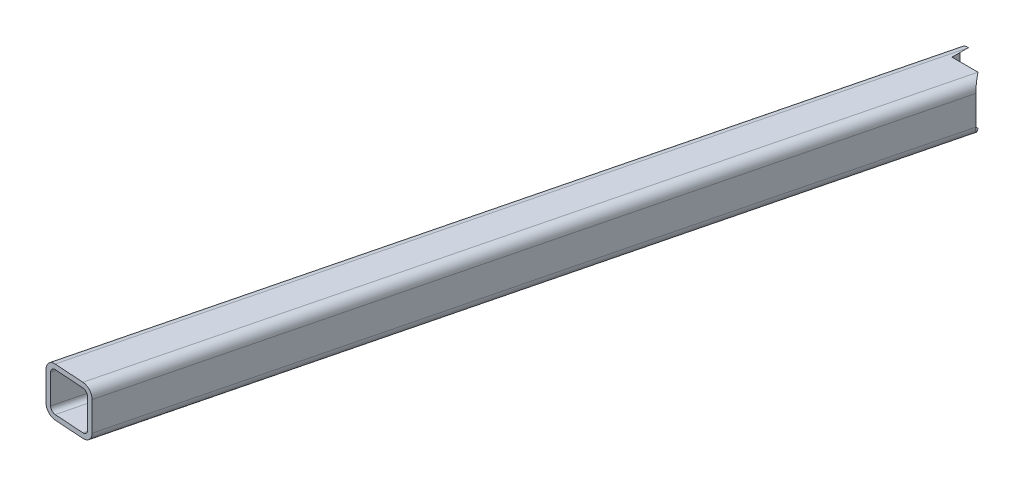
ISO-10303-21;
HEADER;
FILE_DESCRIPTION(('STEP AP214'),'2;1');
FILE_NAME('part.step','',(''),(''),'','','');
FILE_SCHEMA(('AUTOMOTIVE_DESIGN { 1 0 10303 214 1 1 1 1 }'));
ENDSEC;
DATA;
#1=APPLICATION_CONTEXT('core data for automotive mechanical design processes');
#2=APPLICATION_PROTOCOL_DEFINITION('international standard','automotive_design',2000,#1);
#3=PRODUCT_CONTEXT('',#1,'mechanical');
#4=PRODUCT('Part','Part','',(#3));
#5=PRODUCT_RELATED_PRODUCT_CATEGORY('part','',(#4));
#6=PRODUCT_DEFINITION_FORMATION('','',#4);
#7=PRODUCT_DEFINITION_CONTEXT('part definition',#1,'design');
#8=PRODUCT_DEFINITION('design','',#6,#7);
#9=PRODUCT_DEFINITION_SHAPE('','',#8);
#10=(LENGTH_UNIT() NAMED_UNIT(*) SI_UNIT(.MILLI.,.METRE.));
#11=(NAMED_UNIT(*) PLANE_ANGLE_UNIT() SI_UNIT($,.RADIAN.));
#12=(NAMED_UNIT(*) SI_UNIT($,.STERADIAN.) SOLID_ANGLE_UNIT());
#13=UNCERTAINTY_MEASURE_WITH_UNIT(LENGTH_MEASURE(1.E-05),#10,'distance_accuracy_value','');
#14=(GEOMETRIC_REPRESENTATION_CONTEXT(3) GLOBAL_UNCERTAINTY_ASSIGNED_CONTEXT((#13)) GLOBAL_UNIT_ASSIGNED_CONTEXT((#10,
#11,#12)) REPRESENTATION_CONTEXT('',''));
#15=CARTESIAN_POINT('',(0.,0.,0.));
#16=DIRECTION('',(0.,0.,1.));
#17=DIRECTION('',(1.,0.,0.));
#18=AXIS2_PLACEMENT_3D('',#15,#16,#17);
#19=CARTESIAN_POINT('',(-180.820855000872,6.00000000000001,-2001.45521375022));
#20=DIRECTION('',(-0.242535625036333,0.,0.970142500145332));
#21=DIRECTION('',(0.970142500145332,0.,0.242535625036333));
#22=AXIS2_PLACEMENT_3D('',#19,#20,#21);
#23=CYLINDRICAL_SURFACE('',#22,4.);
#24=CARTESIAN_POINT('',(-180.999999999999,6.00000000000001,-2000.73863375371));
#25=DIRECTION('',(-0.122183263695704,0.,0.992507556682903));
#26=DIRECTION('',(-0.992507556682903,0.,-0.122183263695704));
#27=AXIS2_PLACEMENT_3D('',#24,#25,#26);
#28=ELLIPSE('',#27,4.03019601520069,4.);
#29=CARTESIAN_POINT('',(-184.999999999999,6.00000000000001,-2001.23105625618));
#30=VERTEX_POINT('',#29);
#31=CARTESIAN_POINT('',(-180.999999999999,10.,-2000.73863375371));
#32=VERTEX_POINT('',#31);
#33=EDGE_CURVE('E50',#30,#32,#28,.F.);
#34=ORIENTED_EDGE('',*,*,#33,.F.);
#35=DIRECTION('',(-0.242535625036333,0.,0.970142500145332));
#36=VECTOR('',#35,1.);
#37=CARTESIAN_POINT('',(-184.701425001453,6.00000000000001,-2002.42535625036));
#38=LINE('',#37,#36);
#39=CARTESIAN_POINT('',(-260.141225962763,6.00000000000001,-1700.66615240513));
#40=VERTEX_POINT('',#39);
#41=EDGE_CURVE('E44',#30,#40,#38,.T.);
#42=ORIENTED_EDGE('',*,*,#41,.T.);
#43=CARTESIAN_POINT('',(-256.084735577658,6.,-1700.39969144308));
#44=DIRECTION('',(-0.0655463023942976,0.,0.997849528858152));
#45=DIRECTION('',(-0.997849528858152,0.,-0.0655463023942976));
#46=AXIS2_PLACEMENT_3D('',#43,#44,#45);
#47=ELLIPSE('',#46,4.06523255038944,4.);
#48=CARTESIAN_POINT('',(-256.084735577658,10.,-1700.39969144308));
#49=VERTEX_POINT('',#48);
#50=EDGE_CURVE('E252',#49,#40,#47,.T.);
#51=ORIENTED_EDGE('',*,*,#50,.F.);
#52=DIRECTION('',(-0.242535625036333,0.,0.970142500145332));
#53=VECTOR('',#52,1.);
#54=CARTESIAN_POINT('',(-180.820855000872,10.,-2001.45521375022));
#55=LINE('',#54,#53);
#56=EDGE_CURVE('E198',#32,#49,#55,.T.);
#57=ORIENTED_EDGE('',*,*,#56,.F.);
#58=EDGE_LOOP('',(#34,#42,#51,#57));
#59=FACE_BOUND('',#58,.T.);
#60=ADVANCED_FACE('F41',(#59),#23,.T.);
#61=CARTESIAN_POINT('',(-180.820855000872,10.,-2001.45521375022));
#62=DIRECTION('',(0.,-1.,0.));
#63=DIRECTION('',(0.,0.,-1.));
#64=AXIS2_PLACEMENT_3D('',#61,#62,#63);
#65=PLANE('',#64);
#66=DIRECTION('',(-1.,0.,0.));
#67=VECTOR('',#66,1.);
#68=CARTESIAN_POINT('',(175.,10.,-1994.));
#69=LINE('',#68,#67);
#70=CARTESIAN_POINT('',(-170.315341561574,10.,-1994.));
#71=VERTEX_POINT('',#70);
#72=CARTESIAN_POINT('',(-181.,10.,-1994.));
#73=VERTEX_POINT('',#72);
#74=EDGE_CURVE('E207',#71,#73,#69,.T.);
#75=ORIENTED_EDGE('',*,*,#74,.T.);
#76=DIRECTION('',(0.,0.,-1.));
#77=VECTOR('',#76,1.);
#78=CARTESIAN_POINT('',(-180.999999999999,10.,-2000.));
#79=LINE('',#78,#77);
#80=EDGE_CURVE('E200',#73,#32,#79,.T.);
#81=ORIENTED_EDGE('',*,*,#80,.T.);
#82=ORIENTED_EDGE('',*,*,#56,.T.);
#83=DIRECTION('',(-0.997849528858152,0.,-0.0655463023942976));
#84=VECTOR('',#83,1.);
#85=CARTESIAN_POINT('',(-200.834853438986,10.,-1696.77046140671));
#86=LINE('',#85,#84);
#87=CARTESIAN_POINT('',(-243.915264422343,10.,-1699.60030855692));
#88=VERTEX_POINT('',#87);
#89=EDGE_CURVE('E254',#88,#49,#86,.T.);
#90=ORIENTED_EDGE('',*,*,#89,.F.);
#91=DIRECTION('',(-0.242535625036333,0.,0.970142500145332));
#92=VECTOR('',#91,1.);
#93=CARTESIAN_POINT('',(-169.179144999128,10.,-1998.54478624978));
#94=LINE('',#93,#92);
#95=EDGE_CURVE('E194',#71,#88,#94,.T.);
#96=ORIENTED_EDGE('',*,*,#95,.F.);
#97=EDGE_LOOP('',(#75,#81,#82,#90,#96));
#98=FACE_BOUND('',#97,.T.);
#99=ADVANCED_FACE('F381',(#98),#65,.F.);
#100=CARTESIAN_POINT('',(-169.179144999128,6.00000000000001,-1998.54478624978));
#101=DIRECTION('',(-0.242535625036333,0.,0.970142500145332));
#102=DIRECTION('',(0.970142500145332,0.,0.242535625036333));
#103=AXIS2_PLACEMENT_3D('',#100,#101,#102);
#104=CYLINDRICAL_SURFACE('',#103,4.);
#105=CARTESIAN_POINT('',(-170.315341561574,6.00000000000001,-1994.));
#106=DIRECTION('',(-0.788205438016109,0.,0.615412209402636));
#107=DIRECTION('',(0.615412209402636,0.,0.788205438016109));
#108=AXIS2_PLACEMENT_3D('',#105,#106,#107);
#109=ELLIPSE('',#108,5.07481908532361,4.);
#110=CARTESIAN_POINT('',(-167.192235935956,6.00000000000001,-1990.));
#111=VERTEX_POINT('',#110);
#112=EDGE_CURVE('E280',#71,#111,#109,.F.);
#113=ORIENTED_EDGE('',*,*,#112,.F.);
#114=ORIENTED_EDGE('',*,*,#95,.T.);
#115=CARTESIAN_POINT('',(-243.915264422343,6.00000000000001,-1699.60030855692));
#116=DIRECTION('',(-0.0655463023942976,0.,0.997849528858152));
#117=DIRECTION('',(-0.997849528858152,0.,-0.0655463023942976));
#118=AXIS2_PLACEMENT_3D('',#115,#116,#117);
#119=ELLIPSE('',#118,4.06523255038944,4.);
#120=CARTESIAN_POINT('',(-239.858774037238,6.00000000000001,-1699.33384759487));
#121=VERTEX_POINT('',#120);
#122=EDGE_CURVE('E277',#121,#88,#119,.T.);
#123=ORIENTED_EDGE('',*,*,#122,.F.);
#124=DIRECTION('',(-0.242535625036333,0.,0.970142500145332));
#125=VECTOR('',#124,1.);
#126=CARTESIAN_POINT('',(-165.298574998547,6.00000000000001,-1997.57464374964));
#127=LINE('',#126,#125);
#128=EDGE_CURVE('E191',#111,#121,#127,.T.);
#129=ORIENTED_EDGE('',*,*,#128,.F.);
#130=EDGE_LOOP('',(#113,#114,#123,#129));
#131=FACE_BOUND('',#130,.T.);
#132=ADVANCED_FACE('F386',(#131),#104,.T.);
#133=CARTESIAN_POINT('',(-169.179144999128,-6.,-1998.54478624978));
#134=DIRECTION('',(-0.242535625036333,0.,0.970142500145332));
#135=DIRECTION('',(0.970142500145332,0.,0.242535625036333));
#136=AXIS2_PLACEMENT_3D('',#133,#134,#135);
#137=CYLINDRICAL_SURFACE('',#136,4.);
#138=CARTESIAN_POINT('',(-170.315341561574,-6.00000000000001,-1994.));
#139=DIRECTION('',(-0.788205438016109,0.,0.615412209402636));
#140=DIRECTION('',(0.615412209402636,0.,0.788205438016109));
#141=AXIS2_PLACEMENT_3D('',#138,#139,#140);
#142=ELLIPSE('',#141,5.07481908532361,4.);
#143=CARTESIAN_POINT('',(-167.192235935956,-6.00000000000001,-1990.));
#144=VERTEX_POINT('',#143);
#145=CARTESIAN_POINT('',(-170.315341561574,-10.,-1994.));
#146=VERTEX_POINT('',#145);
#147=EDGE_CURVE('E83',#144,#146,#142,.F.);
#148=ORIENTED_EDGE('',*,*,#147,.F.);
#149=DIRECTION('',(-0.242535625036333,0.,0.970142500145332));
#150=VECTOR('',#149,1.);
#151=CARTESIAN_POINT('',(-165.298574998547,-6.00000000000001,-1997.57464374964));
#152=LINE('',#151,#150);
#153=CARTESIAN_POINT('',(-239.858774037238,-6.00000000000001,-1699.33384759487));
#154=VERTEX_POINT('',#153);
#155=EDGE_CURVE('E186',#144,#154,#152,.T.);
#156=ORIENTED_EDGE('',*,*,#155,.T.);
#157=CARTESIAN_POINT('',(-243.915264422343,-6.00000000000001,-1699.60030855692));
#158=DIRECTION('',(-0.0655463023942976,0.,0.997849528858152));
#159=DIRECTION('',(-0.997849528858152,0.,-0.0655463023942976));
#160=AXIS2_PLACEMENT_3D('',#157,#158,#159);
#161=ELLIPSE('',#160,4.06523255038944,4.);
#162=CARTESIAN_POINT('',(-243.915264422343,-10.,-1699.60030855692));
#163=VERTEX_POINT('',#162);
#164=EDGE_CURVE('E271',#163,#154,#161,.T.);
#165=ORIENTED_EDGE('',*,*,#164,.F.);
#166=DIRECTION('',(-0.242535625036333,0.,0.970142500145332));
#167=VECTOR('',#166,1.);
#168=CARTESIAN_POINT('',(-169.179144999128,-10.,-1998.54478624978));
#169=LINE('',#168,#167);
#170=EDGE_CURVE('E187',#146,#163,#169,.T.);
#171=ORIENTED_EDGE('',*,*,#170,.F.);
#172=EDGE_LOOP('',(#148,#156,#165,#171));
#173=FACE_BOUND('',#172,.T.);
#174=ADVANCED_FACE('F434',(#173),#137,.T.);
#175=CARTESIAN_POINT('',(-180.820855000872,-6.,-2001.45521375022));
#176=DIRECTION('',(-0.242535625036333,0.,0.970142500145332));
#177=DIRECTION('',(0.970142500145332,0.,0.242535625036333));
#178=AXIS2_PLACEMENT_3D('',#175,#176,#177);
#179=CYLINDRICAL_SURFACE('',#178,4.);
#180=CARTESIAN_POINT('',(-180.999999999999,-6.,-2000.73863375371));
#181=DIRECTION('',(-0.122183263695704,0.,0.992507556682903));
#182=DIRECTION('',(-0.992507556682903,0.,-0.122183263695704));
#183=AXIS2_PLACEMENT_3D('',#180,#181,#182);
#184=ELLIPSE('',#183,4.03019601520069,4.);
#185=CARTESIAN_POINT('',(-180.999999999999,-10.,-2000.73863375371));
#186=VERTEX_POINT('',#185);
#187=CARTESIAN_POINT('',(-184.999999999999,-6.,-2001.23105625618));
#188=VERTEX_POINT('',#187);
#189=EDGE_CURVE('E221',#186,#188,#184,.F.);
#190=ORIENTED_EDGE('',*,*,#189,.F.);
#191=DIRECTION('',(-0.242535625036333,0.,0.970142500145332));
#192=VECTOR('',#191,1.);
#193=CARTESIAN_POINT('',(-180.820855000872,-10.,-2001.45521375022));
#194=LINE('',#193,#192);
#195=CARTESIAN_POINT('',(-256.084735577658,-10.,-1700.39969144308));
#196=VERTEX_POINT('',#195);
#197=EDGE_CURVE('E183',#186,#196,#194,.T.);
#198=ORIENTED_EDGE('',*,*,#197,.T.);
#199=CARTESIAN_POINT('',(-256.084735577658,-6.00000000000001,-1700.39969144308));
#200=DIRECTION('',(-0.0655463023942976,0.,0.997849528858152));
#201=DIRECTION('',(-0.997849528858152,0.,-0.0655463023942976));
#202=AXIS2_PLACEMENT_3D('',#199,#200,#201);
#203=ELLIPSE('',#202,4.06523255038944,4.);
#204=CARTESIAN_POINT('',(-260.141225962763,-6.00000000000001,-1700.66615240513));
#205=VERTEX_POINT('',#204);
#206=EDGE_CURVE('E241',#205,#196,#203,.T.);
#207=ORIENTED_EDGE('',*,*,#206,.F.);
#208=DIRECTION('',(-0.242535625036333,0.,0.970142500145332));
#209=VECTOR('',#208,1.);
#210=CARTESIAN_POINT('',(-184.701425001453,-6.,-2002.42535625036));
#211=LINE('',#210,#209);
#212=EDGE_CURVE('E155',#188,#205,#211,.T.);
#213=ORIENTED_EDGE('',*,*,#212,.F.);
#214=EDGE_LOOP('',(#190,#198,#207,#213));
#215=FACE_BOUND('',#214,.T.);
#216=ADVANCED_FACE('F242',(#215),#179,.T.);
#217=CARTESIAN_POINT('',(-169.179144999128,6.00000000000001,-1998.54478624978));
#218=DIRECTION('',(-0.242535625036333,0.,0.970142500145332));
#219=DIRECTION('',(0.970142500145332,0.,0.242535625036333));
#220=AXIS2_PLACEMENT_3D('',#217,#218,#219);
#221=CYLINDRICAL_SURFACE('',#220,2.);
#222=DIRECTION('',(-0.242535625036333,0.,0.970142500145332));
#223=VECTOR('',#222,1.);
#224=CARTESIAN_POINT('',(-169.179144999128,8.00000000000001,-1998.54478624978));
#225=LINE('',#224,#223);
#226=CARTESIAN_POINT('',(-171.181366965358,8.00000000000001,-1990.53589838486));
#227=VERTEX_POINT('',#226);
#228=CARTESIAN_POINT('',(-243.915264422343,8.00000000000001,-1699.60030855692));
#229=VERTEX_POINT('',#228);
#230=EDGE_CURVE('E174',#227,#229,#225,.T.);
#231=ORIENTED_EDGE('',*,*,#230,.F.);
#232=CARTESIAN_POINT('',(-171.181366965358,8.00000000000001,-1990.53589838486));
#233=CARTESIAN_POINT('',(-171.130815678857,8.00000752405425,-1990.53591124016));
#234=CARTESIAN_POINT('',(-171.080258716261,7.99819634604764,-1990.53485738036));
#235=CARTESIAN_POINT('',(-170.97949958122,7.99087688892719,-1990.53064229677));
#236=CARTESIAN_POINT('',(-170.92929742934,7.98536839726962,-1990.52748095182));
#237=CARTESIAN_POINT('',(-170.82979605732,7.97062070242167,-1990.51909181607));
#238=CARTESIAN_POINT('',(-170.780494273512,7.96139475022925,-1990.51387136639));
#239=CARTESIAN_POINT('',(-170.682999072482,7.93922893192227,-1990.50149300269));
#240=CARTESIAN_POINT('',(-170.634805563854,7.92628937328789,-1990.49433524907));
#241=CARTESIAN_POINT('',(-170.492314568163,7.88192777966797,-1990.47019887443));
#242=CARTESIAN_POINT('',(-170.400116547533,7.84496428881586,-1990.45055802792));
#243=CARTESIAN_POINT('',(-170.223874579621,7.75726480335626,-1990.40633721655));
#244=CARTESIAN_POINT('',(-170.13983444096,7.70652241745683,-1990.38175496101));
#245=CARTESIAN_POINT('',(-169.979910576913,7.59149905889839,-1990.32968856036));
#246=CARTESIAN_POINT('',(-169.904221572709,7.52696963716145,-1990.30215654857));
#247=CARTESIAN_POINT('',(-169.764103384757,7.38658518679015,-1990.24725969681));
#248=CARTESIAN_POINT('',(-169.699679415521,7.3107249431594,-1990.21989493989));
#249=CARTESIAN_POINT('',(-169.578057299305,7.14255211488049,-1990.16554781241));
#250=CARTESIAN_POINT('',(-169.521928475421,7.04939122202395,-1990.13879279587));
#251=CARTESIAN_POINT('',(-169.424960288601,6.85404713124058,-1990.09094836199));
#252=CARTESIAN_POINT('',(-169.384117018288,6.75186624731845,-1990.06985749715));
#253=CARTESIAN_POINT('',(-169.335245932955,6.59486722594779,-1990.04412986904));
#254=CARTESIAN_POINT('',(-169.321086682618,6.54234916174066,-1990.03657643481));
#255=CARTESIAN_POINT('',(-169.296740695948,6.43613966414227,-1990.0234890807));
#256=CARTESIAN_POINT('',(-169.286553844653,6.3824482647553,-1990.01795510238));
#257=CARTESIAN_POINT('',(-169.270207175452,6.27417088495866,-1990.00903722782));
#258=CARTESIAN_POINT('',(-169.264055497964,6.21958332253817,-1990.00565767824));
#259=CARTESIAN_POINT('',(-169.255843772173,6.10999857846017,-1990.00113421872));
#260=CARTESIAN_POINT('',(-169.253784548767,6.05500131646342,-1989.99999075951));
#261=CARTESIAN_POINT('',(-169.253788748765,6.00000000000002,-1990.));
#262=B_SPLINE_CURVE_WITH_KNOTS('',3,(#232,#233,#234,#235,#236,#237,#238,#239,#240,#241,#242,
#243,#244,#245,#246,#247,#248,#249,#250,#251,#252,#253,#254,#255,#256,#257,#258,#259,#260,#261),
.UNSPECIFIED.,.F.,.F.,(4,2,2,2,2,2,2,2,2,2,2,2,2,2,4),(0.,0.151617545802326,0.303243808235854,
0.454334309254476,0.605412303849104,0.907598141329506,1.20992438678574,1.51824398533683,
1.82670592736256,2.16121140480456,2.49563131562693,2.66021840720861,2.8248007352178,
2.98971407294368,3.15466064808464),.UNSPECIFIED.);
#263=CARTESIAN_POINT('',(-169.253788748765,6.00000000000001,-1990.));
#264=VERTEX_POINT('',#263);
#265=EDGE_CURVE('E182',#227,#264,#262,.T.);
#266=ORIENTED_EDGE('',*,*,#265,.T.);
#267=DIRECTION('',(-0.242535625036333,0.,0.970142500145332));
#268=VECTOR('',#267,1.);
#269=CARTESIAN_POINT('',(-167.238859998837,6.00000000000001,-1998.05971499971));
#270=LINE('',#269,#268);
#271=CARTESIAN_POINT('',(-241.88701922979,6.00000000000001,-1699.4670780759));
#272=VERTEX_POINT('',#271);
#273=EDGE_CURVE('E178',#264,#272,#270,.T.);
#274=ORIENTED_EDGE('',*,*,#273,.T.);
#275=CARTESIAN_POINT('',(-243.915264422343,6.00000000000001,-1699.60030855692));
#276=DIRECTION('',(-0.0655463023942976,0.,0.997849528858152));
#277=DIRECTION('',(-0.997849528858152,0.,-0.0655463023942976));
#278=AXIS2_PLACEMENT_3D('',#275,#276,#277);
#279=ELLIPSE('',#278,2.03261627519472,2.);
#280=EDGE_CURVE('E181',#272,#229,#279,.T.);
#281=ORIENTED_EDGE('',*,*,#280,.T.);
#282=EDGE_LOOP('',(#231,#266,#274,#281));
#283=FACE_BOUND('',#282,.T.);
#284=ADVANCED_FACE('F296',(#283),#221,.F.);
#285=CARTESIAN_POINT('',(-180.820855000872,8.00000000000001,-2001.45521375022));
#286=DIRECTION('',(0.,-1.,0.));
#287=DIRECTION('',(0.,0.,-1.));
#288=AXIS2_PLACEMENT_3D('',#285,#286,#287);
#289=PLANE('',#288);
#290=DIRECTION('',(-0.242535625036333,0.,0.970142500145332));
#291=VECTOR('',#290,1.);
#292=CARTESIAN_POINT('',(-180.820855000872,8.00000000000001,-2001.45521375022));
#293=LINE('',#292,#291);
#294=CARTESIAN_POINT('',(-183.550683842211,8.00000000000001,-1990.53589838486));
#295=VERTEX_POINT('',#294);
#296=CARTESIAN_POINT('',(-256.084735577658,8.00000000000001,-1700.39969144308));
#297=VERTEX_POINT('',#296);
#298=EDGE_CURVE('E170',#295,#297,#293,.T.);
#299=ORIENTED_EDGE('',*,*,#298,.F.);
#300=DIRECTION('',(-1.,0.,0.));
#301=VECTOR('',#300,1.);
#302=CARTESIAN_POINT('',(175.,8.00000000000001,-1990.53589838486));
#303=LINE('',#302,#301);
#304=EDGE_CURVE('E112',#295,#227,#303,.F.);
#305=ORIENTED_EDGE('',*,*,#304,.T.);
#306=ORIENTED_EDGE('',*,*,#230,.T.);
#307=DIRECTION('',(-0.997849528858152,0.,-0.0655463023942976));
#308=VECTOR('',#307,1.);
#309=CARTESIAN_POINT('',(-200.834853438986,8.00000000000001,-1696.77046140671));
#310=LINE('',#309,#308);
#311=EDGE_CURVE('E177',#229,#297,#310,.T.);
#312=ORIENTED_EDGE('',*,*,#311,.T.);
#313=EDGE_LOOP('',(#299,#305,#306,#312));
#314=FACE_BOUND('',#313,.T.);
#315=ADVANCED_FACE('F321',(#314),#289,.T.);
#316=CARTESIAN_POINT('',(-180.820855000872,6.00000000000001,-2001.45521375022));
#317=DIRECTION('',(-0.242535625036333,0.,0.970142500145332));
#318=DIRECTION('',(0.970142500145332,0.,0.242535625036333));
#319=AXIS2_PLACEMENT_3D('',#316,#317,#318);
#320=CYLINDRICAL_SURFACE('',#319,2.);
#321=CARTESIAN_POINT('',(-184.999999999999,6.00000000000001,-1992.98484500494));
#322=CARTESIAN_POINT('',(-185.000001919551,6.02761845763188,-1992.98485061944));
#323=CARTESIAN_POINT('',(-184.999713668836,6.05522140064885,-1992.98362938483));
#324=CARTESIAN_POINT('',(-184.998576225855,6.11018345239519,-1992.97879463064));
#325=CARTESIAN_POINT('',(-184.997727488139,6.13754274051948,-1992.97518304959));
#326=CARTESIAN_POINT('',(-184.994389981888,6.21849170817815,-1992.96094179255));
#327=CARTESIAN_POINT('',(-184.991109138875,6.27147990262467,-1992.94690302008));
#328=CARTESIAN_POINT('',(-184.982786162468,6.37427056731093,-1992.9108733178));
#329=CARTESIAN_POINT('',(-184.977749207021,6.42408189938312,-1992.88890575959));
#330=CARTESIAN_POINT('',(-184.966331439772,6.52015466627054,-1992.83836420858));
#331=CARTESIAN_POINT('',(-184.959947514973,6.56640753316893,-1992.80977489691));
#332=CARTESIAN_POINT('',(-184.941594080695,6.685225613844,-1992.72610360494));
#333=CARTESIAN_POINT('',(-184.928779791177,6.75427828899165,-1992.66623227248));
#334=CARTESIAN_POINT('',(-184.902049595741,6.88221528365521,-1992.53670806784));
#335=CARTESIAN_POINT('',(-184.888130780072,6.94107135097302,-1992.46702895806));
#336=CARTESIAN_POINT('',(-184.861550263646,7.04449628152908,-1992.3285874968));
#337=CARTESIAN_POINT('',(-184.848903126588,7.08990705504357,-1992.26043950613));
#338=CARTESIAN_POINT('',(-184.823874258177,7.17470929701581,-1992.12041291992));
#339=CARTESIAN_POINT('',(-184.811492767251,7.21409549536271,-1992.04853113097));
#340=CARTESIAN_POINT('',(-184.787219897348,7.28781694069086,-1991.90196175207));
#341=CARTESIAN_POINT('',(-184.77532969955,7.32214047287786,-1991.82726814146));
#342=CARTESIAN_POINT('',(-184.752210159511,7.38639117452067,-1991.67596606098));
#343=CARTESIAN_POINT('',(-184.740980581785,7.41631991629844,-1991.59935828747));
#344=CARTESIAN_POINT('',(-184.713976670565,7.48606413297499,-1991.40715662038));
#345=CARTESIAN_POINT('',(-184.698641712027,7.52362834007713,-1991.29068623193));
#346=CARTESIAN_POINT('',(-184.669658046821,7.59216348177901,-1991.05559198812));
#347=CARTESIAN_POINT('',(-184.656010220497,7.62313098026934,-1990.93696704524));
#348=CARTESIAN_POINT('',(-184.630360812124,7.67971584816826,-1990.6980656628));
#349=CARTESIAN_POINT('',(-184.618362142851,7.70532379206722,-1990.57778670367));
#350=CARTESIAN_POINT('',(-184.595965960225,7.75205527685467,-1990.3362029684));
#351=CARTESIAN_POINT('',(-184.585568731868,7.77317801979839,-1990.21489801371));
#352=CARTESIAN_POINT('',(-184.566258185557,7.81170297466984,-1989.97125486162));
#353=CARTESIAN_POINT('',(-184.557348888188,7.82909514098521,-1989.84891477414));
#354=CARTESIAN_POINT('',(-184.540945808072,7.86064907861062,-1989.60372080676));
#355=CARTESIAN_POINT('',(-184.533452149881,7.87481056568999,-1989.48086688263));
#356=CARTESIAN_POINT('',(-184.512954697165,7.91311526908587,-1989.11202195456));
#357=CARTESIAN_POINT('',(-184.50191397312,7.93311830882904,-1988.86548341331));
#358=CARTESIAN_POINT('',(-184.490270583881,7.95398009998402,-1988.53879358623));
#359=CARTESIAN_POINT('',(-184.487659593152,7.95863515834072,-1988.45891800723));
#360=CARTESIAN_POINT('',(-184.482891913227,7.96710192919444,-1988.29936986794));
#361=CARTESIAN_POINT('',(-184.480733770642,7.97091634174082,-1988.21969749477));
#362=CARTESIAN_POINT('',(-184.478786136003,7.97434723895034,-1988.14));
#363=B_SPLINE_CURVE_WITH_KNOTS('',3,(#321,#322,#323,#324,#325,#326,#327,#328,#329,#330,#331,
#332,#333,#334,#335,#336,#337,#338,#339,#340,#341,#342,#343,#344,#345,#346,#347,#348,#349,#350,
#351,#352,#353,#354,#355,#356,#357,#358,#359,#360,#361,#362),.UNSPECIFIED.,.F.,.F.,(4,2,2,2,2,2,
2,2,2,2,2,2,2,2,2,2,2,2,2,2,4),(0.,0.0827977683075994,0.165528470664338,0.329430007782056,
0.492852307516016,0.656656514749492,0.931926362060833,1.20794712032593,1.45617052501278,
1.70460984108047,1.95361530809705,2.20253147035696,2.57225442859986,2.9421695006484,
3.31272975173578,3.68335587263409,4.05496781489839,4.42661243846833,5.16909831818552,
5.409258007403,5.64863471283206),.UNSPECIFIED.);
#364=CARTESIAN_POINT('',(-184.999999999999,6.00000000000001,-1992.98484500494));
#365=VERTEX_POINT('',#364);
#366=CARTESIAN_POINT('',(-184.601781772693,7.73987587542754,-1990.39821822731));
#367=VERTEX_POINT('',#366);
#368=EDGE_CURVE('E58',#365,#367,#363,.T.);
#369=ORIENTED_EDGE('',*,*,#368,.T.);
#370=CARTESIAN_POINT('',(-185.746211251236,6.00000000000001,-1990.));
#371=CARTESIAN_POINT('',(-185.746224383454,6.04896715818431,-1989.99999097312));
#372=CARTESIAN_POINT('',(-185.74413322209,6.09792594762481,-1990.00089889839));
#373=CARTESIAN_POINT('',(-185.735843719474,6.19539736288344,-1990.0044803187));
#374=CARTESIAN_POINT('',(-185.729648152511,6.24391026764673,-1990.00715262115));
#375=CARTESIAN_POINT('',(-185.713308116559,6.33979250511959,-1990.01417009974));
#376=CARTESIAN_POINT('',(-185.703191461001,6.38716745040503,-1990.01850349094));
#377=CARTESIAN_POINT('',(-185.679191975587,6.480773931956,-1990.02871851908));
#378=CARTESIAN_POINT('',(-185.665308697069,6.52700533129184,-1990.03460034044));
#379=CARTESIAN_POINT('',(-185.61839841555,6.66329922026783,-1990.05431637548));
#380=CARTESIAN_POINT('',(-185.580054043862,6.75128386600149,-1990.07024633101));
#381=CARTESIAN_POINT('',(-185.491129307056,6.91993494711505,-1990.10626162268));
#382=CARTESIAN_POINT('',(-185.440529637662,7.00058955798253,-1990.12635350731));
#383=CARTESIAN_POINT('',(-185.323721841197,7.16087534691873,-1990.17117121502));
#384=CARTESIAN_POINT('',(-185.256488649627,7.23968432098822,-1990.19615578589));
#385=CARTESIAN_POINT('',(-185.111707552761,7.38679155130579,-1990.24728252792));
#386=CARTESIAN_POINT('',(-185.034149497414,7.45507932011357,-1990.27342582108));
#387=CARTESIAN_POINT('',(-184.853862204309,7.5933481907216,-1990.33013748644));
#388=CARTESIAN_POINT('',(-184.749209766333,7.66089887484176,-1990.36053627516));
#389=CARTESIAN_POINT('',(-184.529747610258,7.77910839275996,-1990.41683608815));
#390=CARTESIAN_POINT('',(-184.414952034846,7.82979029086328,-1990.44274323033));
#391=CARTESIAN_POINT('',(-184.237199298754,7.89185151166693,-1990.47559404161));
#392=CARTESIAN_POINT('',(-184.177152312549,7.91018793459536,-1990.48552821345));
#393=CARTESIAN_POINT('',(-184.055450743361,7.94201842792534,-1990.50301643532));
#394=CARTESIAN_POINT('',(-183.99379673998,7.95551421896752,-1990.51057133097));
#395=CARTESIAN_POINT('',(-183.868944178657,7.97742886385125,-1990.522940399));
#396=CARTESIAN_POINT('',(-183.805738808762,7.98581827142631,-1990.52773866638));
#397=CARTESIAN_POINT('',(-183.678597327918,7.9971113032285,-1990.5342304944));
#398=CARTESIAN_POINT('',(-183.614660310863,8.00000716164336,-1990.53591965984));
#399=CARTESIAN_POINT('',(-183.550683842211,8.00000000000001,-1990.53589838486));
#400=B_SPLINE_CURVE_WITH_KNOTS('',3,(#370,#371,#372,#373,#374,#375,#376,#377,#378,#379,#380,
#381,#382,#383,#384,#385,#386,#387,#388,#389,#390,#391,#392,#393,#394,#395,#396,#397,#398,#399),
.UNSPECIFIED.,.F.,.F.,(4,2,2,2,2,2,2,2,2,2,2,2,2,2,4),(0.,0.146834761153022,0.293570373468533,
0.43928365317413,0.585014297131163,0.875503111195095,1.16645250724898,1.48498990355303,
1.80384278891793,2.18693202567752,2.56949530071481,2.75998699369149,2.95041090763837,
3.14192275867765,3.33370513428863),.UNSPECIFIED.);
#401=EDGE_CURVE('E106',#367,#295,#400,.T.);
#402=ORIENTED_EDGE('',*,*,#401,.T.);
#403=ORIENTED_EDGE('',*,*,#298,.T.);
#404=CARTESIAN_POINT('',(-256.084735577658,6.,-1700.39969144308));
#405=DIRECTION('',(-0.0655463023942976,0.,0.997849528858152));
#406=DIRECTION('',(-0.997849528858152,0.,-0.0655463023942976));
#407=AXIS2_PLACEMENT_3D('',#404,#405,#406);
#408=ELLIPSE('',#407,2.03261627519472,2.);
#409=CARTESIAN_POINT('',(-258.11298077021,6.00000000000001,-1700.5329219241));
#410=VERTEX_POINT('',#409);
#411=EDGE_CURVE('E173',#297,#410,#408,.T.);
#412=ORIENTED_EDGE('',*,*,#411,.T.);
#413=DIRECTION('',(-0.242535625036333,0.,0.970142500145332));
#414=VECTOR('',#413,1.);
#415=CARTESIAN_POINT('',(-182.761140001163,6.00000000000001,-2001.94028500029));
#416=LINE('',#415,#414);
#417=EDGE_CURVE('E165',#365,#410,#416,.T.);
#418=ORIENTED_EDGE('',*,*,#417,.F.);
#419=EDGE_LOOP('',(#369,#402,#403,#412,#418));
#420=FACE_BOUND('',#419,.T.);
#421=ADVANCED_FACE('F316',(#420),#320,.F.);
#422=CARTESIAN_POINT('',(-182.761140001163,6.00000000000001,-2001.94028500029));
#423=DIRECTION('',(0.970142500145332,0.,0.242535625036333));
#424=DIRECTION('',(0.242535625036333,0.,-0.970142500145332));
#425=AXIS2_PLACEMENT_3D('',#422,#423,#424);
#426=PLANE('',#425);
#427=DIRECTION('',(-0.242535625036333,0.,0.970142500145332));
#428=VECTOR('',#427,1.);
#429=CARTESIAN_POINT('',(-182.761140001163,-6.,-2001.94028500029));
#430=LINE('',#429,#428);
#431=CARTESIAN_POINT('',(-184.999999999999,-6.,-1992.98484500494));
#432=VERTEX_POINT('',#431);
#433=CARTESIAN_POINT('',(-258.11298077021,-6.00000000000001,-1700.5329219241));
#434=VERTEX_POINT('',#433);
#435=EDGE_CURVE('E161',#432,#434,#430,.T.);
#436=ORIENTED_EDGE('',*,*,#435,.F.);
#437=DIRECTION('',(0.,1.,0.));
#438=VECTOR('',#437,1.);
#439=CARTESIAN_POINT('',(-184.999999999999,6.00000000000001,-1992.98484500494));
#440=LINE('',#439,#438);
#441=EDGE_CURVE('E169',#432,#365,#440,.T.);
#442=ORIENTED_EDGE('',*,*,#441,.T.);
#443=ORIENTED_EDGE('',*,*,#417,.T.);
#444=DIRECTION('',(0.,-1.,0.));
#445=VECTOR('',#444,1.);
#446=CARTESIAN_POINT('',(-258.11298077021,6.00000000000001,-1700.5329219241));
#447=LINE('',#446,#445);
#448=EDGE_CURVE('E168',#410,#434,#447,.T.);
#449=ORIENTED_EDGE('',*,*,#448,.T.);
#450=EDGE_LOOP('',(#436,#442,#443,#449));
#451=FACE_BOUND('',#450,.T.);
#452=ADVANCED_FACE('F320',(#451),#426,.T.);
#453=CARTESIAN_POINT('',(-180.820855000872,-6.,-2001.45521375022));
#454=DIRECTION('',(-0.242535625036333,0.,0.970142500145332));
#455=DIRECTION('',(0.970142500145332,0.,0.242535625036333));
#456=AXIS2_PLACEMENT_3D('',#453,#454,#455);
#457=CYLINDRICAL_SURFACE('',#456,2.);
#458=DIRECTION('',(-0.242535625036333,0.,0.970142500145332));
#459=VECTOR('',#458,1.);
#460=CARTESIAN_POINT('',(-180.820855000872,-8.00000000000001,-2001.45521375022));
#461=LINE('',#460,#459);
#462=CARTESIAN_POINT('',(-183.550683842211,-8.00000000000001,-1990.53589838486));
#463=VERTEX_POINT('',#462);
#464=CARTESIAN_POINT('',(-256.084735577658,-8.00000000000001,-1700.39969144308));
#465=VERTEX_POINT('',#464);
#466=EDGE_CURVE('E135',#463,#465,#461,.T.);
#467=ORIENTED_EDGE('',*,*,#466,.F.);
#468=CARTESIAN_POINT('',(-183.550683842211,-8.00000000000001,-1990.53589838486));
#469=CARTESIAN_POINT('',(-183.610151480909,-8.00000572722065,-1990.53591470458));
#470=CARTESIAN_POINT('',(-183.66958974251,-7.9975040424111,-1990.53445731727));
#471=CARTESIAN_POINT('',(-183.787878122978,-7.9877278193583,-1990.52883402798));
#472=CARTESIAN_POINT('',(-183.846728843419,-7.98045881366242,-1990.52467126566));
#473=CARTESIAN_POINT('',(-183.963068049205,-7.96145167017843,-1990.51391064367));
#474=CARTESIAN_POINT('',(-184.020562956046,-7.94974330076172,-1990.50732901266));
#475=CARTESIAN_POINT('',(-184.134237693236,-7.92209778493948,-1990.49203911526));
#476=CARTESIAN_POINT('',(-184.190417132153,-7.90615939681973,-1990.48333022447));
#477=CARTESIAN_POINT('',(-184.355995931723,-7.85250480290467,-1990.45459796619));
#478=CARTESIAN_POINT('',(-184.463064983863,-7.80884245284903,-1990.43190441305));
#479=CARTESIAN_POINT('',(-184.669156698236,-7.706943401606,-1990.38205009575));
#480=CARTESIAN_POINT('',(-184.768156336087,-7.64866680659164,-1990.35487717458));
#481=CARTESIAN_POINT('',(-184.969032051302,-7.50954942543417,-1990.29490069528));
#482=CARTESIAN_POINT('',(-185.069462361515,-7.4267161611552,-1990.26183439137));
#483=CARTESIAN_POINT('',(-185.2542638948,-7.24428961846157,-1990.19722878263));
#484=CARTESIAN_POINT('',(-185.338657755139,-7.14472034494211,-1990.16568737288));
#485=CARTESIAN_POINT('',(-185.469869622932,-6.95525072204995,-1990.11480513234));
#486=CARTESIAN_POINT('',(-185.520859092869,-6.86854401072409,-1990.09433673566));
#487=CARTESIAN_POINT('',(-185.608648946627,-6.68740332393941,-1990.05843266473));
#488=CARTESIAN_POINT('',(-185.64548451381,-6.59298922573623,-1990.04298452622));
#489=CARTESIAN_POINT('',(-185.697701345881,-6.41594783608611,-1990.02087305481));
#490=CARTESIAN_POINT('',(-185.715746877671,-6.33424704892737,-1990.01313056431));
#491=CARTESIAN_POINT('',(-185.733948309541,-6.20999147664819,-1990.00529774502));
#492=CARTESIAN_POINT('',(-185.738537941311,-6.16816743801789,-1990.00331676254));
#493=CARTESIAN_POINT('',(-185.744672288111,-6.08423443665053,-1990.00066589761));
#494=CARTESIAN_POINT('',(-185.746215455897,-6.04212534002556,-1989.99999668139));
#495=CARTESIAN_POINT('',(-185.746211251236,-6.00000000000004,-1990.));
#496=B_SPLINE_CURVE_WITH_KNOTS('',3,(#468,#469,#470,#471,#472,#473,#474,#475,#476,#477,#478,
#479,#480,#481,#482,#483,#484,#485,#486,#487,#488,#489,#490,#491,#492,#493,#494,#495),
.UNSPECIFIED.,.F.,.F.,(4,2,2,2,2,2,2,2,2,2,2,2,2,4),(0.,0.17828827249528,0.356370004029726,
0.533278133580824,0.710238251738085,1.06225629773997,1.41524594351551,1.81632818130489,
2.21683997019757,2.52358699355295,2.82956650366639,3.08062005864676,3.20686730023654,
3.33317864404812),.UNSPECIFIED.);
#497=CARTESIAN_POINT('',(-184.601781772693,-7.73987587542749,-1990.39821822731));
#498=VERTEX_POINT('',#497);
#499=EDGE_CURVE('E130',#463,#498,#496,.T.);
#500=ORIENTED_EDGE('',*,*,#499,.T.);
#501=CARTESIAN_POINT('',(-184.478786136004,-7.97434723894783,-1988.14));
#502=CARTESIAN_POINT('',(-184.481700281451,-7.96920668597602,-1988.25920524378));
#503=CARTESIAN_POINT('',(-184.485083979784,-7.96322352953456,-1988.37836738853));
#504=CARTESIAN_POINT('',(-184.492870151615,-7.94934035615628,-1988.61656538519));
#505=CARTESIAN_POINT('',(-184.497272790874,-7.94144002732636,-1988.73560121337));
#506=CARTESIAN_POINT('',(-184.507194524946,-7.92345811015897,-1988.97392181032));
#507=CARTESIAN_POINT('',(-184.512717819044,-7.91336830730381,-1989.09320579383));
#508=CARTESIAN_POINT('',(-184.524957051479,-7.89072585816875,-1989.33147451648));
#509=CARTESIAN_POINT('',(-184.531672925705,-7.87817334427725,-1989.45045927136));
#510=CARTESIAN_POINT('',(-184.54638222766,-7.85024927776561,-1989.68792010425));
#511=CARTESIAN_POINT('',(-184.554374575947,-7.83488010543132,-1989.80639652596));
#512=CARTESIAN_POINT('',(-184.57173305401,-7.80085779054603,-1990.04277445472));
#513=CARTESIAN_POINT('',(-184.581099102659,-7.78220484191517,-1990.16067599531));
#514=CARTESIAN_POINT('',(-184.601279896416,-7.74106521760995,-1990.3955105398));
#515=CARTESIAN_POINT('',(-184.612092495527,-7.71858420774252,-1990.51244471107));
#516=CARTESIAN_POINT('',(-184.635252559634,-7.66903880191078,-1990.74517323598));
#517=CARTESIAN_POINT('',(-184.647599658505,-7.64197549870476,-1990.86096785443));
#518=CARTESIAN_POINT('',(-184.668167941666,-7.59526847979194,-1991.04097869987));
#519=CARTESIAN_POINT('',(-184.675850929387,-7.57750998408242,-1991.10574562601));
#520=CARTESIAN_POINT('',(-184.691722460108,-7.53999901474811,-1991.23463724598));
#521=CARTESIAN_POINT('',(-184.699911037676,-7.52024640472468,-1991.29876189554));
#522=CARTESIAN_POINT('',(-184.725308575034,-7.45744766066774,-1991.49054685903));
#523=CARTESIAN_POINT('',(-184.743284334683,-7.41100399075424,-1991.61704698039));
#524=CARTESIAN_POINT('',(-184.774144447964,-7.3255433962838,-1991.8197992543));
#525=CARTESIAN_POINT('',(-184.786501131717,-7.28997418057755,-1991.89758496114));
#526=CARTESIAN_POINT('',(-184.811788438994,-7.21322289891861,-1992.05035241441));
#527=CARTESIAN_POINT('',(-184.824719456627,-7.17203693732715,-1992.1253321683));
#528=CARTESIAN_POINT('',(-184.850784222029,-7.08332186883622,-1992.27075264376));
#529=CARTESIAN_POINT('',(-184.863916043252,-7.03583688553921,-1992.34122029593));
#530=CARTESIAN_POINT('',(-184.889981647498,-6.93319094764175,-1992.47628452919));
#531=CARTESIAN_POINT('',(-184.90291577127,-6.87804538379491,-1992.54089246313));
#532=CARTESIAN_POINT('',(-184.924961049935,-6.77257413694502,-1992.64773789062));
#533=CARTESIAN_POINT('',(-184.934267365778,-6.72405618056373,-1992.69170314797));
#534=CARTESIAN_POINT('',(-184.951792166912,-6.62133040013688,-1992.77287135961));
#535=CARTESIAN_POINT('',(-184.960009998561,-6.56711919196656,-1992.8100702556));
#536=CARTESIAN_POINT('',(-184.974756281794,-6.45243195320018,-1992.87582072592));
#537=CARTESIAN_POINT('',(-184.981261731953,-6.39188453540451,-1992.90425536346));
#538=CARTESIAN_POINT('',(-184.991614131837,-6.26633334482818,-1992.94910659918));
#539=CARTESIAN_POINT('',(-184.995470651217,-6.20134655585575,-1992.96556647087));
#540=CARTESIAN_POINT('',(-184.998467575897,-6.11299936789202,-1992.97833180178));
#541=CARTESIAN_POINT('',(-184.999040685795,-6.09047743196963,-1992.98076912356));
#542=CARTESIAN_POINT('',(-184.999806873218,-6.04530816188525,-1992.98402532372));
#543=CARTESIAN_POINT('',(-184.999999910469,-6.02266081468902,-1992.98484403058));
#544=CARTESIAN_POINT('',(-184.999999999999,-6.,-1992.98484500494));
#545=B_SPLINE_CURVE_WITH_KNOTS('',3,(#501,#502,#503,#504,#505,#506,#507,#508,#509,#510,#511,
#512,#513,#514,#515,#516,#517,#518,#519,#520,#521,#522,#523,#524,#525,#526,#527,#528,#529,#530,
#531,#532,#533,#534,#535,#536,#537,#538,#539,#540,#541,#542,#543,#544),.UNSPECIFIED.,.F.,.F.,(4,
2,2,2,2,2,2,2,2,2,2,2,2,2,2,2,2,2,2,2,2,4),(0.,0.358057915368312,0.716174120098842,
1.07565788822533,1.43512233680936,1.79428440034317,2.15342526103009,2.51203911553972,
2.87056757007383,3.07332113519741,3.27608857819736,3.68339784412441,3.94248600754482,
4.20175479090248,4.45929490956809,4.71632489672768,4.91424926046221,5.11229194550752,
5.31287280322872,5.51272516683137,5.5806585194982,5.64859907033024),.UNSPECIFIED.);
#546=EDGE_CURVE('E164',#498,#432,#545,.T.);
#547=ORIENTED_EDGE('',*,*,#546,.T.);
#548=ORIENTED_EDGE('',*,*,#435,.T.);
#549=CARTESIAN_POINT('',(-256.084735577658,-6.00000000000001,-1700.39969144308));
#550=DIRECTION('',(-0.0655463023942976,0.,0.997849528858152));
#551=DIRECTION('',(-0.997849528858152,0.,-0.0655463023942976));
#552=AXIS2_PLACEMENT_3D('',#549,#550,#551);
#553=ELLIPSE('',#552,2.03261627519472,2.);
#554=EDGE_CURVE('E136',#434,#465,#553,.T.);
#555=ORIENTED_EDGE('',*,*,#554,.T.);
#556=EDGE_LOOP('',(#467,#500,#547,#548,#555));
#557=FACE_BOUND('',#556,.T.);
#558=ADVANCED_FACE('F358',(#557),#457,.F.);
#559=CARTESIAN_POINT('',(-169.179144999128,-8.00000000000001,-1998.54478624978));
#560=DIRECTION('',(0.,1.,0.));
#561=DIRECTION('',(0.,0.,1.));
#562=AXIS2_PLACEMENT_3D('',#559,#560,#561);
#563=PLANE('',#562);
#564=DIRECTION('',(-0.242535625036333,0.,0.970142500145332));
#565=VECTOR('',#564,1.);
#566=CARTESIAN_POINT('',(-169.179144999128,-8.00000000000001,-1998.54478624978));
#567=LINE('',#566,#565);
#568=CARTESIAN_POINT('',(-171.181366965358,-8.00000000000001,-1990.53589838486));
#569=VERTEX_POINT('',#568);
#570=CARTESIAN_POINT('',(-243.915264422343,-8.00000000000001,-1699.60030855692));
#571=VERTEX_POINT('',#570);
#572=EDGE_CURVE('E144',#569,#571,#567,.T.);
#573=ORIENTED_EDGE('',*,*,#572,.F.);
#574=DIRECTION('',(-1.,0.,0.));
#575=VECTOR('',#574,1.);
#576=CARTESIAN_POINT('',(175.,-8.00000000000001,-1990.53589838486));
#577=LINE('',#576,#575);
#578=EDGE_CURVE('E124',#569,#463,#577,.T.);
#579=ORIENTED_EDGE('',*,*,#578,.T.);
#580=ORIENTED_EDGE('',*,*,#466,.T.);
#581=DIRECTION('',(0.997849528858152,0.,0.0655463023942976));
#582=VECTOR('',#581,1.);
#583=CARTESIAN_POINT('',(-189.052802402175,-8.00000000000001,-1695.99652720345));
#584=LINE('',#583,#582);
#585=EDGE_CURVE('E148',#465,#571,#584,.T.);
#586=ORIENTED_EDGE('',*,*,#585,.T.);
#587=EDGE_LOOP('',(#573,#579,#580,#586));
#588=FACE_BOUND('',#587,.T.);
#589=ADVANCED_FACE('F151',(#588),#563,.T.);
#590=CARTESIAN_POINT('',(-169.179144999128,-6.,-1998.54478624978));
#591=DIRECTION('',(-0.242535625036333,0.,0.970142500145332));
#592=DIRECTION('',(0.970142500145332,0.,0.242535625036333));
#593=AXIS2_PLACEMENT_3D('',#590,#591,#592);
#594=CYLINDRICAL_SURFACE('',#593,2.);
#595=DIRECTION('',(-0.242535625036333,0.,0.970142500145332));
#596=VECTOR('',#595,1.);
#597=CARTESIAN_POINT('',(-167.238859998837,-6.00000000000001,-1998.05971499971));
#598=LINE('',#597,#596);
#599=CARTESIAN_POINT('',(-169.253788748765,-6.00000000000001,-1990.));
#600=VERTEX_POINT('',#599);
#601=CARTESIAN_POINT('',(-241.88701922979,-6.00000000000001,-1699.4670780759));
#602=VERTEX_POINT('',#601);
#603=EDGE_CURVE('E147',#600,#602,#598,.T.);
#604=ORIENTED_EDGE('',*,*,#603,.F.);
#605=CARTESIAN_POINT('',(-169.253788748765,-6.00000000000001,-1990.));
#606=CARTESIAN_POINT('',(-169.2537844173,-6.05541227681401,-1989.99999047117));
#607=CARTESIAN_POINT('',(-169.255874593308,-6.11082041195171,-1990.00115122343));
#608=CARTESIAN_POINT('',(-169.264209391385,-6.22121798911677,-1990.00574233988));
#609=CARTESIAN_POINT('',(-169.270453187011,-6.27620751223406,-1990.00917225256));
#610=CARTESIAN_POINT('',(-169.287040162992,-6.38524494053364,-1990.01821960056));
#611=CARTESIAN_POINT('',(-169.297373176059,-6.43929483662927,-1990.02383160979));
#612=CARTESIAN_POINT('',(-169.322065593627,-6.54619636213333,-1990.03709998784));
#613=CARTESIAN_POINT('',(-169.336425079978,-6.59904796715902,-1990.04475639822));
#614=CARTESIAN_POINT('',(-169.385426092638,-6.75523603264174,-1990.07053389349));
#615=CARTESIAN_POINT('',(-169.426008596506,-6.8563265228954,-1990.0914738324));
#616=CARTESIAN_POINT('',(-169.522159922182,-7.04968732301922,-1990.13889868098));
#617=CARTESIAN_POINT('',(-169.577738116249,-7.14195206781216,-1990.16538705608));
#618=CARTESIAN_POINT('',(-169.704355729337,-7.31735079965791,-1990.22200279201));
#619=CARTESIAN_POINT('',(-169.775714635614,-7.40023289573802,-1990.25219857235));
#620=CARTESIAN_POINT('',(-169.931940731191,-7.55214452034187,-1990.31251612127));
#621=CARTESIAN_POINT('',(-170.01680466097,-7.62117738239877,-1990.34263790593));
#622=CARTESIAN_POINT('',(-170.197464661589,-7.74265201692883,-1990.39894271106));
#623=CARTESIAN_POINT('',(-170.293133332521,-7.79526425162434,-1990.42516461096));
#624=CARTESIAN_POINT('',(-170.493670527779,-7.88307555410435,-1990.47062422761));
#625=CARTESIAN_POINT('',(-170.598529783074,-7.91829193361807,-1990.48986888277));
#626=CARTESIAN_POINT('',(-170.783431322946,-7.96299109188665,-1990.51472546731));
#627=CARTESIAN_POINT('',(-170.862123216528,-7.97693189620949,-1990.52265221653));
#628=CARTESIAN_POINT('',(-171.020995374399,-7.99546091562148,-1990.53327871374));
#629=CARTESIAN_POINT('',(-171.101176438875,-8.00004394656062,-1990.53597556434));
#630=CARTESIAN_POINT('',(-171.181366965358,-8.00000000000001,-1990.53589838486));
#631=B_SPLINE_CURVE_WITH_KNOTS('',3,(#605,#606,#607,#608,#609,#610,#611,#612,#613,#614,#615,
#616,#617,#618,#619,#620,#621,#622,#623,#624,#625,#626,#627,#628,#629,#630),.UNSPECIFIED.,.F.,
.F.,(4,2,2,2,2,2,2,2,2,2,2,2,4),(0.,0.166178181769755,0.332323309063444,0.498057908438425,
0.663795877148359,0.994908532908495,1.32622861431457,1.6649969087039,2.00368356292043,
2.33872741602138,2.67343717041519,2.91366183826913,3.15401955307082),.UNSPECIFIED.);
#632=EDGE_CURVE('E127',#600,#569,#631,.T.);
#633=ORIENTED_EDGE('',*,*,#632,.T.);
#634=ORIENTED_EDGE('',*,*,#572,.T.);
#635=CARTESIAN_POINT('',(-243.915264422343,-6.00000000000001,-1699.60030855692));
#636=DIRECTION('',(-0.0655463023942976,0.,0.997849528858152));
#637=DIRECTION('',(-0.997849528858152,0.,-0.0655463023942976));
#638=AXIS2_PLACEMENT_3D('',#635,#636,#637);
#639=ELLIPSE('',#638,2.03261627519472,2.);
#640=EDGE_CURVE('E153',#571,#602,#639,.T.);
#641=ORIENTED_EDGE('',*,*,#640,.T.);
#642=EDGE_LOOP('',(#604,#633,#634,#641));
#643=FACE_BOUND('',#642,.T.);
#644=ADVANCED_FACE('F141',(#643),#594,.F.);
#645=CARTESIAN_POINT('',(-184.701425001453,6.00000000000001,-2002.42535625036));
#646=DIRECTION('',(0.970142500145332,0.,0.242535625036333));
#647=DIRECTION('',(0.242535625036333,0.,-0.970142500145332));
#648=AXIS2_PLACEMENT_3D('',#645,#646,#647);
#649=PLANE('',#648);
#650=DIRECTION('',(0.,1.,0.));
#651=VECTOR('',#650,1.);
#652=CARTESIAN_POINT('',(-184.999999999999,6.00000000000001,-2001.23105625618));
#653=LINE('',#652,#651);
#654=EDGE_CURVE('E219',#188,#30,#653,.T.);
#655=ORIENTED_EDGE('',*,*,#654,.F.);
#656=ORIENTED_EDGE('',*,*,#212,.T.);
#657=DIRECTION('',(0.,-1.,0.));
#658=VECTOR('',#657,1.);
#659=CARTESIAN_POINT('',(-260.141225962763,6.00000000000001,-1700.66615240513));
#660=LINE('',#659,#658);
#661=EDGE_CURVE('E233',#40,#205,#660,.T.);
#662=ORIENTED_EDGE('',*,*,#661,.F.);
#663=ORIENTED_EDGE('',*,*,#41,.F.);
#664=EDGE_LOOP('',(#655,#656,#662,#663));
#665=FACE_BOUND('',#664,.T.);
#666=ADVANCED_FACE('F229',(#665),#649,.F.);
#667=CARTESIAN_POINT('',(-165.298574998547,-6.00000000000001,-1997.57464374964));
#668=DIRECTION('',(-0.970142500145332,0.,-0.242535625036333));
#669=DIRECTION('',(-0.242535625036333,0.,0.970142500145332));
#670=AXIS2_PLACEMENT_3D('',#667,#668,#669);
#671=PLANE('',#670);
#672=DIRECTION('',(0.,-1.,0.));
#673=VECTOR('',#672,1.);
#674=CARTESIAN_POINT('',(-167.192235935956,-6.00000000000001,-1990.));
#675=LINE('',#674,#673);
#676=EDGE_CURVE('E314',#111,#144,#675,.T.);
#677=ORIENTED_EDGE('',*,*,#676,.F.);
#678=ORIENTED_EDGE('',*,*,#128,.T.);
#679=DIRECTION('',(0.,1.,0.));
#680=VECTOR('',#679,1.);
#681=CARTESIAN_POINT('',(-239.858774037238,-6.00000000000001,-1699.33384759487));
#682=LINE('',#681,#680);
#683=EDGE_CURVE('E274',#154,#121,#682,.T.);
#684=ORIENTED_EDGE('',*,*,#683,.F.);
#685=ORIENTED_EDGE('',*,*,#155,.F.);
#686=EDGE_LOOP('',(#677,#678,#684,#685));
#687=FACE_BOUND('',#686,.T.);
#688=ADVANCED_FACE('F379',(#687),#671,.F.);
#689=CARTESIAN_POINT('',(-169.179144999128,-10.,-1998.54478624978));
#690=DIRECTION('',(0.,1.,0.));
#691=DIRECTION('',(0.,0.,1.));
#692=AXIS2_PLACEMENT_3D('',#689,#690,#691);
#693=PLANE('',#692);
#694=DIRECTION('',(0.,0.,-1.));
#695=VECTOR('',#694,1.);
#696=CARTESIAN_POINT('',(-180.999999999999,-10.,-2000.));
#697=LINE('',#696,#695);
#698=CARTESIAN_POINT('',(-181.,-10.,-1994.));
#699=VERTEX_POINT('',#698);
#700=EDGE_CURVE('E220',#699,#186,#697,.T.);
#701=ORIENTED_EDGE('',*,*,#700,.F.);
#702=DIRECTION('',(-1.,0.,0.));
#703=VECTOR('',#702,1.);
#704=CARTESIAN_POINT('',(175.,-10.,-1994.));
#705=LINE('',#704,#703);
#706=EDGE_CURVE('E74',#146,#699,#705,.T.);
#707=ORIENTED_EDGE('',*,*,#706,.F.);
#708=ORIENTED_EDGE('',*,*,#170,.T.);
#709=DIRECTION('',(0.997849528858152,0.,0.0655463023942976));
#710=VECTOR('',#709,1.);
#711=CARTESIAN_POINT('',(-189.052802402175,-10.,-1695.99652720345));
#712=LINE('',#711,#710);
#713=EDGE_CURVE('E248',#196,#163,#712,.T.);
#714=ORIENTED_EDGE('',*,*,#713,.F.);
#715=ORIENTED_EDGE('',*,*,#197,.F.);
#716=EDGE_LOOP('',(#701,#707,#708,#714,#715));
#717=FACE_BOUND('',#716,.T.);
#718=ADVANCED_FACE('F435',(#717),#693,.F.);
#719=CARTESIAN_POINT('',(-167.238859998837,-6.00000000000001,-1998.05971499971));
#720=DIRECTION('',(-0.970142500145332,0.,-0.242535625036333));
#721=DIRECTION('',(-0.242535625036333,0.,0.970142500145332));
#722=AXIS2_PLACEMENT_3D('',#719,#720,#721);
#723=PLANE('',#722);
#724=ORIENTED_EDGE('',*,*,#273,.F.);
#725=DIRECTION('',(0.,-1.,0.));
#726=VECTOR('',#725,1.);
#727=CARTESIAN_POINT('',(-169.253788748765,-6.00000000000001,-1990.));
#728=LINE('',#727,#726);
#729=EDGE_CURVE('E190',#264,#600,#728,.T.);
#730=ORIENTED_EDGE('',*,*,#729,.T.);
#731=ORIENTED_EDGE('',*,*,#603,.T.);
#732=DIRECTION('',(0.,1.,0.));
#733=VECTOR('',#732,1.);
#734=CARTESIAN_POINT('',(-241.88701922979,-6.00000000000001,-1699.4670780759));
#735=LINE('',#734,#733);
#736=EDGE_CURVE('E281',#602,#272,#735,.T.);
#737=ORIENTED_EDGE('',*,*,#736,.T.);
#738=EDGE_LOOP('',(#724,#730,#731,#737));
#739=FACE_BOUND('',#738,.T.);
#740=ADVANCED_FACE('F349',(#739),#723,.T.);
#741=CARTESIAN_POINT('',(-250.,0.,-1700.));
#742=DIRECTION('',(-0.0655463023942976,0.,0.997849528858152));
#743=DIRECTION('',(0.997849528858152,0.,0.0655463023942976));
#744=AXIS2_PLACEMENT_3D('',#741,#742,#743);
#745=PLANE('',#744);
#746=ORIENTED_EDGE('',*,*,#280,.F.);
#747=ORIENTED_EDGE('',*,*,#736,.F.);
#748=ORIENTED_EDGE('',*,*,#640,.F.);
#749=ORIENTED_EDGE('',*,*,#585,.F.);
#750=ORIENTED_EDGE('',*,*,#554,.F.);
#751=ORIENTED_EDGE('',*,*,#448,.F.);
#752=ORIENTED_EDGE('',*,*,#411,.F.);
#753=ORIENTED_EDGE('',*,*,#311,.F.);
#754=EDGE_LOOP('',(#746,#747,#748,#749,#750,#751,#752,#753));
#755=FACE_BOUND('',#754,.T.);
#756=ORIENTED_EDGE('',*,*,#89,.T.);
#757=ORIENTED_EDGE('',*,*,#50,.T.);
#758=ORIENTED_EDGE('',*,*,#661,.T.);
#759=ORIENTED_EDGE('',*,*,#206,.T.);
#760=ORIENTED_EDGE('',*,*,#713,.T.);
#761=ORIENTED_EDGE('',*,*,#164,.T.);
#762=ORIENTED_EDGE('',*,*,#683,.T.);
#763=ORIENTED_EDGE('',*,*,#122,.T.);
#764=EDGE_LOOP('',(#756,#757,#758,#759,#760,#761,#762,#763));
#765=FACE_BOUND('',#764,.T.);
#766=ADVANCED_FACE('F251',(#755,#765),#745,.T.);
#767=CARTESIAN_POINT('',(175.,6.00000000000001,-1994.));
#768=DIRECTION('',(-1.,0.,0.));
#769=DIRECTION('',(0.,0.,1.));
#770=AXIS2_PLACEMENT_3D('',#767,#768,#769);
#771=CYLINDRICAL_SURFACE('',#770,4.);
#772=ORIENTED_EDGE('',*,*,#112,.T.);
#773=DIRECTION('',(-1.,0.,0.));
#774=VECTOR('',#773,1.);
#775=CARTESIAN_POINT('',(175.,6.00000000000001,-1990.));
#776=LINE('',#775,#774);
#777=EDGE_CURVE('E286',#111,#264,#776,.T.);
#778=ORIENTED_EDGE('',*,*,#777,.T.);
#779=ORIENTED_EDGE('',*,*,#265,.F.);
#780=ORIENTED_EDGE('',*,*,#304,.F.);
#781=ORIENTED_EDGE('',*,*,#401,.F.);
#782=CARTESIAN_POINT('',(-181.,6.00000000000001,-1994.));
#783=DIRECTION('',(-0.707106781186548,0.,-0.707106781186548));
#784=DIRECTION('',(-0.707106781186548,0.,0.707106781186548));
#785=AXIS2_PLACEMENT_3D('',#782,#783,#784);
#786=ELLIPSE('',#785,5.65685424949239,4.);
#787=EDGE_CURVE('E213',#367,#73,#786,.T.);
#788=ORIENTED_EDGE('',*,*,#787,.T.);
#789=ORIENTED_EDGE('',*,*,#74,.F.);
#790=EDGE_LOOP('',(#772,#778,#779,#780,#781,#788,#789));
#791=FACE_BOUND('',#790,.T.);
#792=ADVANCED_FACE('F300',(#791),#771,.F.);
#793=CARTESIAN_POINT('',(175.,-6.00000000000001,-1990.));
#794=DIRECTION('',(0.,0.,-1.));
#795=DIRECTION('',(-1.,0.,0.));
#796=AXIS2_PLACEMENT_3D('',#793,#794,#795);
#797=PLANE('',#796);
#798=ORIENTED_EDGE('',*,*,#676,.T.);
#799=DIRECTION('',(-1.,0.,0.));
#800=VECTOR('',#799,1.);
#801=CARTESIAN_POINT('',(175.,-6.00000000000001,-1990.));
#802=LINE('',#801,#800);
#803=EDGE_CURVE('E397',#144,#600,#802,.T.);
#804=ORIENTED_EDGE('',*,*,#803,.T.);
#805=ORIENTED_EDGE('',*,*,#729,.F.);
#806=ORIENTED_EDGE('',*,*,#777,.F.);
#807=EDGE_LOOP('',(#798,#804,#805,#806));
#808=FACE_BOUND('',#807,.T.);
#809=ADVANCED_FACE('F305',(#808),#797,.T.);
#810=CARTESIAN_POINT('',(175.,-6.00000000000001,-1994.));
#811=DIRECTION('',(-1.,0.,0.));
#812=DIRECTION('',(0.,0.,1.));
#813=AXIS2_PLACEMENT_3D('',#810,#811,#812);
#814=CYLINDRICAL_SURFACE('',#813,4.);
#815=ORIENTED_EDGE('',*,*,#147,.T.);
#816=ORIENTED_EDGE('',*,*,#706,.T.);
#817=CARTESIAN_POINT('',(-181.,-6.,-1994.));
#818=DIRECTION('',(-0.707106781186548,0.,-0.707106781186548));
#819=DIRECTION('',(-0.707106781186548,0.,0.707106781186548));
#820=AXIS2_PLACEMENT_3D('',#817,#818,#819);
#821=ELLIPSE('',#820,5.65685424949239,4.);
#822=EDGE_CURVE('E394',#699,#498,#821,.T.);
#823=ORIENTED_EDGE('',*,*,#822,.T.);
#824=ORIENTED_EDGE('',*,*,#499,.F.);
#825=ORIENTED_EDGE('',*,*,#578,.F.);
#826=ORIENTED_EDGE('',*,*,#632,.F.);
#827=ORIENTED_EDGE('',*,*,#803,.F.);
#828=EDGE_LOOP('',(#815,#816,#823,#824,#825,#826,#827));
#829=FACE_BOUND('',#828,.T.);
#830=ADVANCED_FACE('F126',(#829),#814,.F.);
#831=CARTESIAN_POINT('',(-180.999999999999,-6.,-2000.));
#832=DIRECTION('',(0.,0.,-1.));
#833=DIRECTION('',(-1.,0.,0.));
#834=AXIS2_PLACEMENT_3D('',#831,#832,#833);
#835=CYLINDRICAL_SURFACE('',#834,4.);
#836=ORIENTED_EDGE('',*,*,#189,.T.);
#837=DIRECTION('',(0.,0.,-1.));
#838=VECTOR('',#837,1.);
#839=CARTESIAN_POINT('',(-184.999999999999,-6.,-2000.));
#840=LINE('',#839,#838);
#841=EDGE_CURVE('E216',#432,#188,#840,.T.);
#842=ORIENTED_EDGE('',*,*,#841,.F.);
#843=ORIENTED_EDGE('',*,*,#546,.F.);
#844=ORIENTED_EDGE('',*,*,#822,.F.);
#845=ORIENTED_EDGE('',*,*,#700,.T.);
#846=EDGE_LOOP('',(#836,#842,#843,#844,#845));
#847=FACE_BOUND('',#846,.T.);
#848=ADVANCED_FACE('F343',(#847),#835,.F.);
#849=CARTESIAN_POINT('',(-184.999999999999,-6.,-2000.));
#850=DIRECTION('',(1.,0.,0.));
#851=DIRECTION('',(0.,0.,-1.));
#852=AXIS2_PLACEMENT_3D('',#849,#850,#851);
#853=PLANE('',#852);
#854=ORIENTED_EDGE('',*,*,#841,.T.);
#855=ORIENTED_EDGE('',*,*,#654,.T.);
#856=DIRECTION('',(0.,0.,-1.));
#857=VECTOR('',#856,1.);
#858=CARTESIAN_POINT('',(-184.999999999999,6.00000000000001,-2000.));
#859=LINE('',#858,#857);
#860=EDGE_CURVE('E11',#365,#30,#859,.T.);
#861=ORIENTED_EDGE('',*,*,#860,.F.);
#862=ORIENTED_EDGE('',*,*,#441,.F.);
#863=EDGE_LOOP('',(#854,#855,#861,#862));
#864=FACE_BOUND('',#863,.T.);
#865=ADVANCED_FACE('F339',(#864),#853,.T.);
#866=CARTESIAN_POINT('',(-180.999999999999,6.00000000000001,-2000.));
#867=DIRECTION('',(0.,0.,-1.));
#868=DIRECTION('',(-1.,0.,0.));
#869=AXIS2_PLACEMENT_3D('',#866,#867,#868);
#870=CYLINDRICAL_SURFACE('',#869,4.);
#871=ORIENTED_EDGE('',*,*,#33,.T.);
#872=ORIENTED_EDGE('',*,*,#80,.F.);
#873=ORIENTED_EDGE('',*,*,#787,.F.);
#874=ORIENTED_EDGE('',*,*,#368,.F.);
#875=ORIENTED_EDGE('',*,*,#860,.T.);
#876=EDGE_LOOP('',(#871,#872,#873,#874,#875));
#877=FACE_BOUND('',#876,.T.);
#878=ADVANCED_FACE('F335',(#877),#870,.F.);
#879=CLOSED_SHELL('',(#60,#99,#132,#174,#216,#284,#315,#421,#452,#558,#589,#644,#666,#688,#718,
#740,#766,#792,#809,#830,#848,#865,#878));
#880=MANIFOLD_SOLID_BREP('B2',#879);
#881=ADVANCED_BREP_SHAPE_REPRESENTATION('',(#18,#880),#14);
#882=SHAPE_DEFINITION_REPRESENTATION(#9,#881);
ENDSEC;
END-ISO-10303-21;
